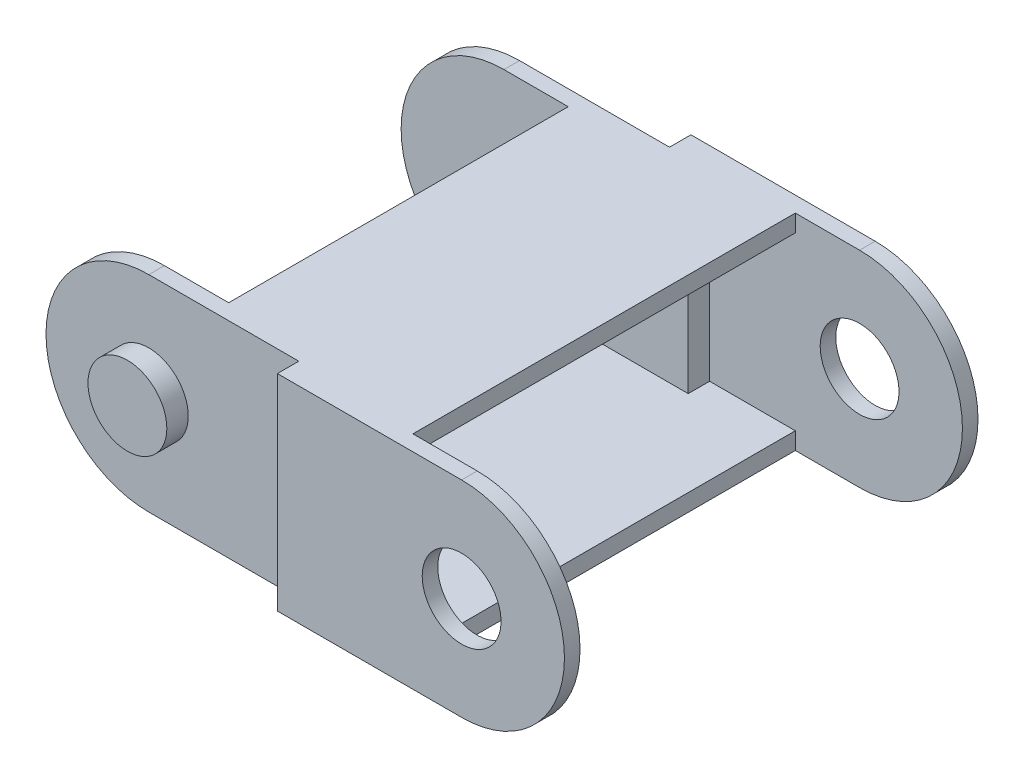
ISO-10303-21;
HEADER;
FILE_DESCRIPTION(('STEP AP214'),'2;1');
FILE_NAME('part.step','',(''),(''),'','','');
FILE_SCHEMA(('AUTOMOTIVE_DESIGN { 1 0 10303 214 1 1 1 1 }'));
ENDSEC;
DATA;
#1=APPLICATION_CONTEXT('core data for automotive mechanical design processes');
#2=APPLICATION_PROTOCOL_DEFINITION('international standard','automotive_design',2000,#1);
#3=PRODUCT_CONTEXT('',#1,'mechanical');
#4=PRODUCT('Part','Part','',(#3));
#5=PRODUCT_RELATED_PRODUCT_CATEGORY('part','',(#4));
#6=PRODUCT_DEFINITION_FORMATION('','',#4);
#7=PRODUCT_DEFINITION_CONTEXT('part definition',#1,'design');
#8=PRODUCT_DEFINITION('design','',#6,#7);
#9=PRODUCT_DEFINITION_SHAPE('','',#8);
#10=(LENGTH_UNIT() NAMED_UNIT(*) SI_UNIT(.MILLI.,.METRE.));
#11=(NAMED_UNIT(*) PLANE_ANGLE_UNIT() SI_UNIT($,.RADIAN.));
#12=(NAMED_UNIT(*) SI_UNIT($,.STERADIAN.) SOLID_ANGLE_UNIT());
#13=UNCERTAINTY_MEASURE_WITH_UNIT(LENGTH_MEASURE(1.E-05),#10,'distance_accuracy_value','');
#14=(GEOMETRIC_REPRESENTATION_CONTEXT(3) GLOBAL_UNCERTAINTY_ASSIGNED_CONTEXT((#13)) GLOBAL_UNIT_ASSIGNED_CONTEXT((#10,
#11,#12)) REPRESENTATION_CONTEXT('',''));
#15=CARTESIAN_POINT('',(0.,0.,0.));
#16=DIRECTION('',(0.,0.,1.));
#17=DIRECTION('',(1.,0.,0.));
#18=AXIS2_PLACEMENT_3D('',#15,#16,#17);
#19=CARTESIAN_POINT('',(-3.74999999999999,6.00000000000001,11.156));
#20=DIRECTION('',(-1.,0.,0.));
#21=DIRECTION('',(0.,0.,1.));
#22=AXIS2_PLACEMENT_3D('',#19,#20,#21);
#23=PLANE('',#22);
#24=DIRECTION('',(0.,0.,-1.));
#25=VECTOR('',#24,1.);
#26=CARTESIAN_POINT('',(-3.75,-5.,9.90600000000001));
#27=LINE('',#26,#25);
#28=CARTESIAN_POINT('',(-3.74999999999999,-5.00000000000003,11.156));
#29=VERTEX_POINT('',#28);
#30=CARTESIAN_POINT('',(-3.75,-5.,-11.156));
#31=VERTEX_POINT('',#30);
#32=EDGE_CURVE('E410',#29,#31,#27,.T.);
#33=ORIENTED_EDGE('',*,*,#32,.F.);
#34=DIRECTION('',(0.,-1.,0.));
#35=VECTOR('',#34,1.);
#36=CARTESIAN_POINT('',(-3.74999999999999,6.00000000000001,11.156));
#37=LINE('',#36,#35);
#38=CARTESIAN_POINT('',(-3.75,-6.00000000000001,11.156));
#39=VERTEX_POINT('',#38);
#40=EDGE_CURVE('E266',#29,#39,#37,.T.);
#41=ORIENTED_EDGE('',*,*,#40,.T.);
#42=DIRECTION('',(0.,0.,-1.));
#43=VECTOR('',#42,1.);
#44=CARTESIAN_POINT('',(-3.75,-6.00000000000001,11.156));
#45=LINE('',#44,#43);
#46=CARTESIAN_POINT('',(-3.75,-6.00000000000001,-11.156));
#47=VERTEX_POINT('',#46);
#48=EDGE_CURVE('E253',#39,#47,#45,.T.);
#49=ORIENTED_EDGE('',*,*,#48,.T.);
#50=DIRECTION('',(0.,-1.,0.));
#51=VECTOR('',#50,1.);
#52=CARTESIAN_POINT('',(-3.74999999999999,6.00000000000001,-11.156));
#53=LINE('',#52,#51);
#54=EDGE_CURVE('E252',#31,#47,#53,.T.);
#55=ORIENTED_EDGE('',*,*,#54,.F.);
#56=EDGE_LOOP('',(#33,#41,#49,#55));
#57=FACE_BOUND('',#56,.T.);
#58=ADVANCED_FACE('F37',(#57),#23,.F.);
#59=CARTESIAN_POINT('',(-25.5,6.00000000000001,-9.906));
#60=DIRECTION('',(0.,0.,-1.));
#61=DIRECTION('',(-1.,0.,0.));
#62=AXIS2_PLACEMENT_3D('',#59,#60,#61);
#63=PLANE('',#62);
#64=DIRECTION('',(0.,-1.,0.));
#65=VECTOR('',#64,1.);
#66=CARTESIAN_POINT('',(-8.75000000000001,5.,-9.90599999999998));
#67=LINE('',#66,#65);
#68=CARTESIAN_POINT('',(-8.75000000000001,5.,-9.90599999999998));
#69=VERTEX_POINT('',#68);
#70=CARTESIAN_POINT('',(-8.74999999999999,-5.00000000000002,-9.906));
#71=VERTEX_POINT('',#70);
#72=EDGE_CURVE('E52',#69,#71,#67,.T.);
#73=ORIENTED_EDGE('',*,*,#72,.F.);
#74=DIRECTION('',(1.,0.,0.));
#75=VECTOR('',#74,1.);
#76=CARTESIAN_POINT('',(-25.5,5.,-9.90599999999998));
#77=LINE('',#76,#75);
#78=CARTESIAN_POINT('',(-15.75,5.,-9.90599999999998));
#79=VERTEX_POINT('',#78);
#80=EDGE_CURVE('E226',#79,#69,#77,.T.);
#81=ORIENTED_EDGE('',*,*,#80,.F.);
#82=DIRECTION('',(0.,-1.,0.));
#83=VECTOR('',#82,1.);
#84=CARTESIAN_POINT('',(-15.75,6.00000000000001,-9.906));
#85=LINE('',#84,#83);
#86=CARTESIAN_POINT('',(-15.75,6.00000000000001,-9.906));
#87=VERTEX_POINT('',#86);
#88=EDGE_CURVE('E288',#87,#79,#85,.T.);
#89=ORIENTED_EDGE('',*,*,#88,.F.);
#90=DIRECTION('',(1.,0.,0.));
#91=VECTOR('',#90,1.);
#92=CARTESIAN_POINT('',(-25.5,6.00000000000001,-9.906));
#93=LINE('',#92,#91);
#94=CARTESIAN_POINT('',(-19.5,6.00000000000001,-9.906));
#95=VERTEX_POINT('',#94);
#96=EDGE_CURVE('E270',#95,#87,#93,.T.);
#97=ORIENTED_EDGE('',*,*,#96,.F.);
#98=CARTESIAN_POINT('',(-19.5,0.,-9.906));
#99=DIRECTION('',(0.,0.,-1.));
#100=DIRECTION('',(-1.,0.,0.));
#101=AXIS2_PLACEMENT_3D('',#98,#99,#100);
#102=CIRCLE('',#101,6.);
#103=CARTESIAN_POINT('',(-19.5,-5.99999999999999,-9.90599999999999));
#104=VERTEX_POINT('',#103);
#105=EDGE_CURVE('E328',#104,#95,#102,.T.);
#106=ORIENTED_EDGE('',*,*,#105,.F.);
#107=DIRECTION('',(-1.,0.,0.));
#108=VECTOR('',#107,1.);
#109=CARTESIAN_POINT('',(0.,-5.99999999999999,-9.906));
#110=LINE('',#109,#108);
#111=CARTESIAN_POINT('',(-15.75,-6.00000000000006,-9.906));
#112=VERTEX_POINT('',#111);
#113=EDGE_CURVE('E378',#112,#104,#110,.T.);
#114=ORIENTED_EDGE('',*,*,#113,.F.);
#115=CARTESIAN_POINT('',(-15.75,-5.,-9.906));
#116=VERTEX_POINT('',#115);
#117=EDGE_CURVE('E280',#116,#112,#85,.T.);
#118=ORIENTED_EDGE('',*,*,#117,.F.);
#119=DIRECTION('',(1.,0.,0.));
#120=VECTOR('',#119,1.);
#121=CARTESIAN_POINT('',(-25.5,-5.,-9.906));
#122=LINE('',#121,#120);
#123=EDGE_CURVE('E59',#116,#71,#122,.T.);
#124=ORIENTED_EDGE('',*,*,#123,.T.);
#125=EDGE_LOOP('',(#73,#81,#89,#97,#106,#114,#118,#124));
#126=FACE_BOUND('',#125,.T.);
#127=ADVANCED_FACE('F392',(#126),#63,.F.);
#128=CARTESIAN_POINT('',(-15.75,6.00000000000001,9.906));
#129=DIRECTION('',(1.,0.,0.));
#130=DIRECTION('',(0.,1.,0.));
#131=AXIS2_PLACEMENT_3D('',#128,#129,#130);
#132=PLANE('',#131);
#133=ORIENTED_EDGE('',*,*,#88,.T.);
#134=DIRECTION('',(0.,0.,1.));
#135=VECTOR('',#134,1.);
#136=CARTESIAN_POINT('',(-15.75,4.99999999999999,9.906));
#137=LINE('',#136,#135);
#138=CARTESIAN_POINT('',(-15.75,4.99999999999999,9.906));
#139=VERTEX_POINT('',#138);
#140=EDGE_CURVE('E11',#79,#139,#137,.T.);
#141=ORIENTED_EDGE('',*,*,#140,.T.);
#142=DIRECTION('',(0.,-1.,0.));
#143=VECTOR('',#142,1.);
#144=CARTESIAN_POINT('',(-15.75,6.00000000000001,9.906));
#145=LINE('',#144,#143);
#146=CARTESIAN_POINT('',(-15.75,6.00000000000001,9.906));
#147=VERTEX_POINT('',#146);
#148=EDGE_CURVE('E224',#147,#139,#145,.T.);
#149=ORIENTED_EDGE('',*,*,#148,.F.);
#150=DIRECTION('',(0.,0.,1.));
#151=VECTOR('',#150,1.);
#152=CARTESIAN_POINT('',(-15.75,6.00000000000001,9.906));
#153=LINE('',#152,#151);
#154=EDGE_CURVE('E273',#87,#147,#153,.T.);
#155=ORIENTED_EDGE('',*,*,#154,.F.);
#156=EDGE_LOOP('',(#133,#141,#149,#155));
#157=FACE_BOUND('',#156,.T.);
#158=ADVANCED_FACE('F478',(#157),#132,.F.);
#159=CARTESIAN_POINT('',(0.,0.,12.065));
#160=DIRECTION('',(0.,0.,-1.));
#161=DIRECTION('',(-1.,0.,0.));
#162=AXIS2_PLACEMENT_3D('',#159,#160,#161);
#163=CYLINDRICAL_SURFACE('',#162,6.);
#164=DIRECTION('',(0.,0.,-1.));
#165=VECTOR('',#164,1.);
#166=CARTESIAN_POINT('',(0.,-6.00000000000001,12.065));
#167=LINE('',#166,#165);
#168=CARTESIAN_POINT('',(0.,-6.00000000000001,12.065));
#169=VERTEX_POINT('',#168);
#170=CARTESIAN_POINT('',(0.,-6.00000000000001,11.156));
#171=VERTEX_POINT('',#170);
#172=EDGE_CURVE('E356',#169,#171,#167,.T.);
#173=ORIENTED_EDGE('',*,*,#172,.T.);
#174=CARTESIAN_POINT('',(0.,0.,11.156));
#175=DIRECTION('',(0.,0.,1.));
#176=DIRECTION('',(0.,-1.,0.));
#177=AXIS2_PLACEMENT_3D('',#174,#175,#176);
#178=CIRCLE('',#177,6.);
#179=CARTESIAN_POINT('',(0.,5.99999999999999,11.156));
#180=VERTEX_POINT('',#179);
#181=EDGE_CURVE('E322',#171,#180,#178,.T.);
#182=ORIENTED_EDGE('',*,*,#181,.T.);
#183=DIRECTION('',(0.,0.,-1.));
#184=VECTOR('',#183,1.);
#185=CARTESIAN_POINT('',(0.,5.99999999999999,12.065));
#186=LINE('',#185,#184);
#187=CARTESIAN_POINT('',(0.,5.99999999999999,12.065));
#188=VERTEX_POINT('',#187);
#189=EDGE_CURVE('E367',#188,#180,#186,.T.);
#190=ORIENTED_EDGE('',*,*,#189,.F.);
#191=CARTESIAN_POINT('',(0.,0.,12.065));
#192=DIRECTION('',(0.,0.,1.));
#193=DIRECTION('',(1.,0.,0.));
#194=AXIS2_PLACEMENT_3D('',#191,#192,#193);
#195=CIRCLE('',#194,6.);
#196=EDGE_CURVE('E339',#169,#188,#195,.T.);
#197=ORIENTED_EDGE('',*,*,#196,.F.);
#198=EDGE_LOOP('',(#173,#182,#190,#197));
#199=FACE_BOUND('',#198,.T.);
#200=ADVANCED_FACE('F441',(#199),#163,.T.);
#201=CARTESIAN_POINT('',(-19.5,0.,12.065));
#202=DIRECTION('',(0.,0.,-1.));
#203=DIRECTION('',(-1.,0.,0.));
#204=AXIS2_PLACEMENT_3D('',#201,#202,#203);
#205=CYLINDRICAL_SURFACE('',#204,6.);
#206=DIRECTION('',(0.,0.,-1.));
#207=VECTOR('',#206,1.);
#208=CARTESIAN_POINT('',(-19.5,5.99999999999998,12.065));
#209=LINE('',#208,#207);
#210=CARTESIAN_POINT('',(-19.5,6.00000000000001,10.815));
#211=VERTEX_POINT('',#210);
#212=CARTESIAN_POINT('',(-19.5,6.00000000000001,9.906));
#213=VERTEX_POINT('',#212);
#214=EDGE_CURVE('E366',#211,#213,#209,.T.);
#215=ORIENTED_EDGE('',*,*,#214,.T.);
#216=CARTESIAN_POINT('',(-19.5,0.,9.906));
#217=DIRECTION('',(0.,0.,1.));
#218=DIRECTION('',(1.,0.,0.));
#219=AXIS2_PLACEMENT_3D('',#216,#217,#218);
#220=CIRCLE('',#219,6.);
#221=CARTESIAN_POINT('',(-19.5,-5.99999999999999,9.906));
#222=VERTEX_POINT('',#221);
#223=EDGE_CURVE('E330',#213,#222,#220,.T.);
#224=ORIENTED_EDGE('',*,*,#223,.T.);
#225=DIRECTION('',(0.,0.,-1.));
#226=VECTOR('',#225,1.);
#227=CARTESIAN_POINT('',(-19.5,-5.99999999999999,12.065));
#228=LINE('',#227,#226);
#229=CARTESIAN_POINT('',(-19.5,-5.99999999999999,10.815));
#230=VERTEX_POINT('',#229);
#231=EDGE_CURVE('E362',#230,#222,#228,.T.);
#232=ORIENTED_EDGE('',*,*,#231,.F.);
#233=CARTESIAN_POINT('',(-19.5,0.,10.815));
#234=DIRECTION('',(0.,0.,-1.));
#235=DIRECTION('',(-1.,0.,0.));
#236=AXIS2_PLACEMENT_3D('',#233,#234,#235);
#237=CIRCLE('',#236,6.);
#238=EDGE_CURVE('E324',#230,#211,#237,.T.);
#239=ORIENTED_EDGE('',*,*,#238,.T.);
#240=EDGE_LOOP('',(#215,#224,#232,#239));
#241=FACE_BOUND('',#240,.T.);
#242=ADVANCED_FACE('F455',(#241),#205,.T.);
#243=CARTESIAN_POINT('',(0.,0.,12.065));
#244=DIRECTION('',(0.,0.,-1.));
#245=DIRECTION('',(-1.,0.,0.));
#246=AXIS2_PLACEMENT_3D('',#243,#244,#245);
#247=CYLINDRICAL_SURFACE('',#246,2.2999954);
#248=CARTESIAN_POINT('',(0.,0.,11.156));
#249=DIRECTION('',(0.,0.,1.));
#250=DIRECTION('',(0.,-1.,0.));
#251=AXIS2_PLACEMENT_3D('',#248,#249,#250);
#252=CIRCLE('',#251,2.2999954);
#253=CARTESIAN_POINT('',(-2.2999954,0.,11.156));
#254=VERTEX_POINT('',#253);
#255=EDGE_CURVE('E321',#254,#254,#252,.T.);
#256=CARTESIAN_POINT('',(0.,0.,12.065));
#257=DIRECTION('',(0.,0.,1.));
#258=DIRECTION('',(1.,0.,0.));
#259=AXIS2_PLACEMENT_3D('',#256,#257,#258);
#260=CIRCLE('',#259,2.2999954);
#261=CARTESIAN_POINT('',(-2.2999954,0.,12.065));
#262=VERTEX_POINT('',#261);
#263=EDGE_CURVE('E333',#262,#262,#260,.T.);
#264=CARTESIAN_POINT('',(-2.2999954,0.,11.156));
#265=CARTESIAN_POINT('',(-2.2999954,0.,11.16546875));
#266=CARTESIAN_POINT('',(-2.2999954,0.,11.1749375));
#267=CARTESIAN_POINT('',(-2.2999954,0.,11.193875));
#268=CARTESIAN_POINT('',(-2.2999954,0.,11.20334375));
#269=CARTESIAN_POINT('',(-2.2999954,0.,11.22228125));
#270=CARTESIAN_POINT('',(-2.2999954,0.,11.23175));
#271=CARTESIAN_POINT('',(-2.2999954,0.,11.2506875));
#272=CARTESIAN_POINT('',(-2.2999954,0.,11.26015625));
#273=CARTESIAN_POINT('',(-2.2999954,0.,11.27909375));
#274=CARTESIAN_POINT('',(-2.2999954,0.,11.2885625));
#275=CARTESIAN_POINT('',(-2.2999954,0.,11.3075));
#276=CARTESIAN_POINT('',(-2.2999954,0.,11.31696875));
#277=CARTESIAN_POINT('',(-2.2999954,0.,11.33590625));
#278=CARTESIAN_POINT('',(-2.2999954,0.,11.345375));
#279=CARTESIAN_POINT('',(-2.2999954,0.,11.3643125));
#280=CARTESIAN_POINT('',(-2.2999954,0.,11.37378125));
#281=CARTESIAN_POINT('',(-2.2999954,0.,11.39271875));
#282=CARTESIAN_POINT('',(-2.2999954,0.,11.4021875));
#283=CARTESIAN_POINT('',(-2.2999954,0.,11.421125));
#284=CARTESIAN_POINT('',(-2.2999954,0.,11.43059375));
#285=CARTESIAN_POINT('',(-2.2999954,0.,11.44953125));
#286=CARTESIAN_POINT('',(-2.2999954,0.,11.459));
#287=CARTESIAN_POINT('',(-2.2999954,0.,11.4779375));
#288=CARTESIAN_POINT('',(-2.2999954,0.,11.48740625));
#289=CARTESIAN_POINT('',(-2.2999954,0.,11.50634375));
#290=CARTESIAN_POINT('',(-2.2999954,0.,11.5158125));
#291=CARTESIAN_POINT('',(-2.2999954,0.,11.53475));
#292=CARTESIAN_POINT('',(-2.2999954,0.,11.54421875));
#293=CARTESIAN_POINT('',(-2.2999954,0.,11.56315625));
#294=CARTESIAN_POINT('',(-2.2999954,0.,11.572625));
#295=CARTESIAN_POINT('',(-2.2999954,0.,11.5915625));
#296=CARTESIAN_POINT('',(-2.2999954,0.,11.60103125));
#297=CARTESIAN_POINT('',(-2.2999954,0.,11.61996875));
#298=CARTESIAN_POINT('',(-2.2999954,0.,11.6294375));
#299=CARTESIAN_POINT('',(-2.2999954,0.,11.648375));
#300=CARTESIAN_POINT('',(-2.2999954,0.,11.65784375));
#301=CARTESIAN_POINT('',(-2.2999954,0.,11.67678125));
#302=CARTESIAN_POINT('',(-2.2999954,0.,11.68625));
#303=CARTESIAN_POINT('',(-2.2999954,0.,11.7051875));
#304=CARTESIAN_POINT('',(-2.2999954,0.,11.71465625));
#305=CARTESIAN_POINT('',(-2.2999954,0.,11.73359375));
#306=CARTESIAN_POINT('',(-2.2999954,0.,11.7430625));
#307=CARTESIAN_POINT('',(-2.2999954,0.,11.762));
#308=CARTESIAN_POINT('',(-2.2999954,0.,11.77146875));
#309=CARTESIAN_POINT('',(-2.2999954,0.,11.79040625));
#310=CARTESIAN_POINT('',(-2.2999954,0.,11.799875));
#311=CARTESIAN_POINT('',(-2.2999954,0.,11.8188125));
#312=CARTESIAN_POINT('',(-2.2999954,0.,11.82828125));
#313=CARTESIAN_POINT('',(-2.2999954,0.,11.84721875));
#314=CARTESIAN_POINT('',(-2.2999954,0.,11.8566875));
#315=CARTESIAN_POINT('',(-2.2999954,0.,11.875625));
#316=CARTESIAN_POINT('',(-2.2999954,0.,11.88509375));
#317=CARTESIAN_POINT('',(-2.2999954,0.,11.90403125));
#318=CARTESIAN_POINT('',(-2.2999954,0.,11.9135));
#319=CARTESIAN_POINT('',(-2.2999954,0.,11.9324375));
#320=CARTESIAN_POINT('',(-2.2999954,0.,11.94190625));
#321=CARTESIAN_POINT('',(-2.2999954,0.,11.96084375));
#322=CARTESIAN_POINT('',(-2.2999954,0.,11.9703125));
#323=CARTESIAN_POINT('',(-2.2999954,0.,11.98925));
#324=CARTESIAN_POINT('',(-2.2999954,0.,11.99871875));
#325=CARTESIAN_POINT('',(-2.2999954,0.,12.01765625));
#326=CARTESIAN_POINT('',(-2.2999954,0.,12.027125));
#327=CARTESIAN_POINT('',(-2.2999954,0.,12.0460625));
#328=CARTESIAN_POINT('',(-2.2999954,0.,12.05553125));
#329=CARTESIAN_POINT('',(-2.2999954,0.,12.065));
#330=B_SPLINE_CURVE_WITH_KNOTS('',3,(#264,#265,#266,#267,#268,#269,#270,#271,#272,#273,#274,
#275,#276,#277,#278,#279,#280,#281,#282,#283,#284,#285,#286,#287,#288,#289,#290,#291,#292,#293,
#294,#295,#296,#297,#298,#299,#300,#301,#302,#303,#304,#305,#306,#307,#308,#309,#310,#311,#312,
#313,#314,#315,#316,#317,#318,#319,#320,#321,#322,#323,#324,#325,#326,#327,#328,#329),
.UNSPECIFIED.,.F.,.F.,(4,2,2,2,2,2,2,2,2,2,2,2,2,2,2,2,2,2,2,2,2,2,2,2,2,2,2,2,2,2,2,2,4),(0.,
0.0284062500000015,0.0568125000000013,0.0852187500000011,0.113625000000001,0.142031250000001,
0.1704375,0.19884375,0.22725,0.255656250000002,0.284062500000001,0.312468750000001,
0.340875000000001,0.369281250000001,0.3976875,0.42609375,0.4545,0.482906250000002,
0.511312500000001,0.539718750000001,0.568125000000001,0.596531250000001,0.6249375,0.65334375,
0.681750000000002,0.710156250000002,0.738562500000001,0.766968750000001,0.795375000000001,
0.823781250000001,0.852187500000001,0.88059375,0.909000000000002),.UNSPECIFIED.);
#331=EDGE_CURVE('BSEAM625',#254,#262,#330,.T.);
#332=ORIENTED_EDGE('',*,*,#255,.F.);
#333=ORIENTED_EDGE('',*,*,#263,.T.);
#334=ORIENTED_EDGE('',*,*,#331,.T.);
#335=ORIENTED_EDGE('',*,*,#331,.F.);
#336=EDGE_LOOP('',(#332,#334,#333,#335));
#337=FACE_BOUND('',#336,.T.);
#338=ADVANCED_FACE('F625',(#337),#247,.F.);
#339=CARTESIAN_POINT('',(0.,0.,12.065));
#340=DIRECTION('',(0.,0.,1.));
#341=DIRECTION('',(1.,0.,0.));
#342=AXIS2_PLACEMENT_3D('',#339,#340,#341);
#343=PLANE('',#342);
#344=DIRECTION('',(0.,-1.,0.));
#345=VECTOR('',#344,1.);
#346=CARTESIAN_POINT('',(-10.75,6.00000000000001,12.065));
#347=LINE('',#346,#345);
#348=CARTESIAN_POINT('',(-10.75,6.00000000000001,12.065));
#349=VERTEX_POINT('',#348);
#350=CARTESIAN_POINT('',(-10.75,-6.00000000000001,12.065));
#351=VERTEX_POINT('',#350);
#352=EDGE_CURVE('E298',#349,#351,#347,.T.);
#353=ORIENTED_EDGE('',*,*,#352,.T.);
#354=DIRECTION('',(1.,0.,0.));
#355=VECTOR('',#354,1.);
#356=CARTESIAN_POINT('',(0.,-6.00000000000001,12.065));
#357=LINE('',#356,#355);
#358=EDGE_CURVE('E346',#351,#169,#357,.T.);
#359=ORIENTED_EDGE('',*,*,#358,.T.);
#360=ORIENTED_EDGE('',*,*,#196,.T.);
#361=DIRECTION('',(-1.,0.,0.));
#362=VECTOR('',#361,1.);
#363=CARTESIAN_POINT('',(0.,5.99999999999999,12.065));
#364=LINE('',#363,#362);
#365=EDGE_CURVE('E342',#188,#349,#364,.T.);
#366=ORIENTED_EDGE('',*,*,#365,.T.);
#367=EDGE_LOOP('',(#353,#359,#360,#366));
#368=FACE_BOUND('',#367,.T.);
#369=ORIENTED_EDGE('',*,*,#263,.F.);
#370=EDGE_LOOP('',(#369));
#371=FACE_BOUND('',#370,.T.);
#372=ADVANCED_FACE('F443',(#368,#371),#343,.T.);
#373=CARTESIAN_POINT('',(0.,0.,-12.065));
#374=DIRECTION('',(0.,0.,1.));
#375=DIRECTION('',(1.,0.,0.));
#376=AXIS2_PLACEMENT_3D('',#373,#374,#375);
#377=PLANE('',#376);
#378=DIRECTION('',(1.,0.,0.));
#379=VECTOR('',#378,1.);
#380=CARTESIAN_POINT('',(0.,-6.00000000000001,-12.065));
#381=LINE('',#380,#379);
#382=CARTESIAN_POINT('',(-10.75,-6.00000000000001,-12.065));
#383=VERTEX_POINT('',#382);
#384=CARTESIAN_POINT('',(0.,-6.00000000000001,-12.065));
#385=VERTEX_POINT('',#384);
#386=EDGE_CURVE('E343',#383,#385,#381,.T.);
#387=ORIENTED_EDGE('',*,*,#386,.F.);
#388=DIRECTION('',(0.,-1.,0.));
#389=VECTOR('',#388,1.);
#390=CARTESIAN_POINT('',(-10.75,6.00000000000001,-12.065));
#391=LINE('',#390,#389);
#392=CARTESIAN_POINT('',(-10.75,6.00000000000001,-12.065));
#393=VERTEX_POINT('',#392);
#394=EDGE_CURVE('E312',#393,#383,#391,.T.);
#395=ORIENTED_EDGE('',*,*,#394,.F.);
#396=DIRECTION('',(-1.,0.,0.));
#397=VECTOR('',#396,1.);
#398=CARTESIAN_POINT('',(0.,5.99999999999999,-12.065));
#399=LINE('',#398,#397);
#400=CARTESIAN_POINT('',(0.,5.99999999999999,-12.065));
#401=VERTEX_POINT('',#400);
#402=EDGE_CURVE('E351',#401,#393,#399,.T.);
#403=ORIENTED_EDGE('',*,*,#402,.F.);
#404=CARTESIAN_POINT('',(0.,0.,-12.065));
#405=DIRECTION('',(0.,0.,1.));
#406=DIRECTION('',(1.,0.,0.));
#407=AXIS2_PLACEMENT_3D('',#404,#405,#406);
#408=CIRCLE('',#407,6.);
#409=EDGE_CURVE('E336',#385,#401,#408,.T.);
#410=ORIENTED_EDGE('',*,*,#409,.F.);
#411=EDGE_LOOP('',(#387,#395,#403,#410));
#412=FACE_BOUND('',#411,.T.);
#413=CARTESIAN_POINT('',(0.,0.,-12.065));
#414=DIRECTION('',(0.,0.,1.));
#415=DIRECTION('',(1.,0.,0.));
#416=AXIS2_PLACEMENT_3D('',#413,#414,#415);
#417=CIRCLE('',#416,2.2999954);
#418=CARTESIAN_POINT('',(-2.2999954,0.,-12.065));
#419=VERTEX_POINT('',#418);
#420=EDGE_CURVE('E332',#419,#419,#417,.T.);
#421=ORIENTED_EDGE('',*,*,#420,.T.);
#422=EDGE_LOOP('',(#421));
#423=FACE_BOUND('',#422,.T.);
#424=ADVANCED_FACE('F463',(#412,#423),#377,.F.);
#425=CARTESIAN_POINT('',(0.,5.99999999999999,-11.156));
#426=VERTEX_POINT('',#425);
#427=EDGE_CURVE('E371',#426,#401,#186,.T.);
#428=ORIENTED_EDGE('',*,*,#427,.F.);
#429=CARTESIAN_POINT('',(0.,0.,-11.156));
#430=DIRECTION('',(0.,0.,-1.));
#431=DIRECTION('',(0.,1.,0.));
#432=AXIS2_PLACEMENT_3D('',#429,#430,#431);
#433=CIRCLE('',#432,6.);
#434=CARTESIAN_POINT('',(0.,-6.00000000000001,-11.156));
#435=VERTEX_POINT('',#434);
#436=EDGE_CURVE('E319',#426,#435,#433,.T.);
#437=ORIENTED_EDGE('',*,*,#436,.T.);
#438=EDGE_CURVE('E348',#435,#385,#167,.T.);
#439=ORIENTED_EDGE('',*,*,#438,.T.);
#440=ORIENTED_EDGE('',*,*,#409,.T.);
#441=EDGE_LOOP('',(#428,#437,#439,#440));
#442=FACE_BOUND('',#441,.T.);
#443=ADVANCED_FACE('F39',(#442),#163,.T.);
#444=CARTESIAN_POINT('',(0.,5.99999999999999,12.065));
#445=DIRECTION('',(0.,-1.,0.));
#446=DIRECTION('',(1.,0.,0.));
#447=AXIS2_PLACEMENT_3D('',#444,#445,#446);
#448=PLANE('',#447);
#449=ORIENTED_EDGE('',*,*,#189,.T.);
#450=DIRECTION('',(-1.,0.,0.));
#451=VECTOR('',#450,1.);
#452=CARTESIAN_POINT('',(-3.74999999999999,6.00000000000001,11.156));
#453=LINE('',#452,#451);
#454=CARTESIAN_POINT('',(-3.74999999999999,6.00000000000001,11.156));
#455=VERTEX_POINT('',#454);
#456=EDGE_CURVE('E249',#180,#455,#453,.T.);
#457=ORIENTED_EDGE('',*,*,#456,.T.);
#458=DIRECTION('',(0.,0.,-1.));
#459=VECTOR('',#458,1.);
#460=CARTESIAN_POINT('',(-3.74999999999999,6.00000000000001,11.156));
#461=LINE('',#460,#459);
#462=CARTESIAN_POINT('',(-3.74999999999999,6.00000000000001,-11.156));
#463=VERTEX_POINT('',#462);
#464=EDGE_CURVE('E242',#455,#463,#461,.T.);
#465=ORIENTED_EDGE('',*,*,#464,.T.);
#466=DIRECTION('',(1.,0.,0.));
#467=VECTOR('',#466,1.);
#468=CARTESIAN_POINT('',(-3.74999999999999,6.00000000000001,-11.156));
#469=LINE('',#468,#467);
#470=EDGE_CURVE('E245',#463,#426,#469,.T.);
#471=ORIENTED_EDGE('',*,*,#470,.T.);
#472=ORIENTED_EDGE('',*,*,#427,.T.);
#473=ORIENTED_EDGE('',*,*,#402,.T.);
#474=DIRECTION('',(0.,0.,1.));
#475=VECTOR('',#474,1.);
#476=CARTESIAN_POINT('',(-10.75,6.00000000000001,-10.815));
#477=LINE('',#476,#475);
#478=CARTESIAN_POINT('',(-10.75,6.00000000000001,-10.815));
#479=VERTEX_POINT('',#478);
#480=EDGE_CURVE('E305',#393,#479,#477,.T.);
#481=ORIENTED_EDGE('',*,*,#480,.T.);
#482=DIRECTION('',(-1.,0.,0.));
#483=VECTOR('',#482,1.);
#484=CARTESIAN_POINT('',(-25.5,6.00000000000001,-10.815));
#485=LINE('',#484,#483);
#486=CARTESIAN_POINT('',(-19.5,6.00000000000001,-10.815));
#487=VERTEX_POINT('',#486);
#488=EDGE_CURVE('E308',#479,#487,#485,.T.);
#489=ORIENTED_EDGE('',*,*,#488,.T.);
#490=EDGE_CURVE('E363',#95,#487,#209,.T.);
#491=ORIENTED_EDGE('',*,*,#490,.F.);
#492=ORIENTED_EDGE('',*,*,#96,.T.);
#493=ORIENTED_EDGE('',*,*,#154,.T.);
#494=DIRECTION('',(-1.,0.,0.));
#495=VECTOR('',#494,1.);
#496=CARTESIAN_POINT('',(-25.5,6.00000000000001,9.906));
#497=LINE('',#496,#495);
#498=EDGE_CURVE('E277',#147,#213,#497,.T.);
#499=ORIENTED_EDGE('',*,*,#498,.T.);
#500=ORIENTED_EDGE('',*,*,#214,.F.);
#501=DIRECTION('',(1.,0.,0.));
#502=VECTOR('',#501,1.);
#503=CARTESIAN_POINT('',(-10.75,6.00000000000001,10.815));
#504=LINE('',#503,#502);
#505=CARTESIAN_POINT('',(-10.75,6.00000000000001,10.815));
#506=VERTEX_POINT('',#505);
#507=EDGE_CURVE('E294',#211,#506,#504,.T.);
#508=ORIENTED_EDGE('',*,*,#507,.T.);
#509=DIRECTION('',(0.,0.,1.));
#510=VECTOR('',#509,1.);
#511=CARTESIAN_POINT('',(-10.75,6.00000000000001,12.065));
#512=LINE('',#511,#510);
#513=EDGE_CURVE('E291',#506,#349,#512,.T.);
#514=ORIENTED_EDGE('',*,*,#513,.T.);
#515=ORIENTED_EDGE('',*,*,#365,.F.);
#516=EDGE_LOOP('',(#449,#457,#465,#471,#472,#473,#481,#489,#491,#492,#493,#499,#500,#508,#514,#515));
#517=FACE_BOUND('',#516,.T.);
#518=ADVANCED_FACE('F433',(#517),#448,.F.);
#519=ORIENTED_EDGE('',*,*,#105,.T.);
#520=ORIENTED_EDGE('',*,*,#490,.T.);
#521=CARTESIAN_POINT('',(-19.5,0.,-10.815));
#522=DIRECTION('',(0.,0.,1.));
#523=DIRECTION('',(1.,0.,0.));
#524=AXIS2_PLACEMENT_3D('',#521,#522,#523);
#525=CIRCLE('',#524,6.);
#526=CARTESIAN_POINT('',(-19.5,-5.99999999999999,-10.815));
#527=VERTEX_POINT('',#526);
#528=EDGE_CURVE('E326',#487,#527,#525,.T.);
#529=ORIENTED_EDGE('',*,*,#528,.T.);
#530=EDGE_CURVE('E359',#104,#527,#228,.T.);
#531=ORIENTED_EDGE('',*,*,#530,.F.);
#532=EDGE_LOOP('',(#519,#520,#529,#531));
#533=FACE_BOUND('',#532,.T.);
#534=ADVANCED_FACE('F474',(#533),#205,.T.);
#535=CARTESIAN_POINT('',(0.,-6.00000000000001,12.065));
#536=DIRECTION('',(0.,1.,0.));
#537=DIRECTION('',(-1.,0.,0.));
#538=AXIS2_PLACEMENT_3D('',#535,#536,#537);
#539=PLANE('',#538);
#540=ORIENTED_EDGE('',*,*,#48,.F.);
#541=DIRECTION('',(-1.,0.,0.));
#542=VECTOR('',#541,1.);
#543=CARTESIAN_POINT('',(-3.75,-6.00000000000001,11.156));
#544=LINE('',#543,#542);
#545=EDGE_CURVE('E246',#171,#39,#544,.T.);
#546=ORIENTED_EDGE('',*,*,#545,.F.);
#547=ORIENTED_EDGE('',*,*,#172,.F.);
#548=ORIENTED_EDGE('',*,*,#358,.F.);
#549=DIRECTION('',(0.,0.,1.));
#550=VECTOR('',#549,1.);
#551=CARTESIAN_POINT('',(-10.75,-6.00000000000001,12.065));
#552=LINE('',#551,#550);
#553=CARTESIAN_POINT('',(-10.75,-6.00000000000001,10.815));
#554=VERTEX_POINT('',#553);
#555=EDGE_CURVE('E295',#554,#351,#552,.T.);
#556=ORIENTED_EDGE('',*,*,#555,.F.);
#557=DIRECTION('',(-1.,0.,0.));
#558=VECTOR('',#557,1.);
#559=CARTESIAN_POINT('',(0.,-6.00000000000001,10.815));
#560=LINE('',#559,#558);
#561=EDGE_CURVE('E370',#554,#230,#560,.T.);
#562=ORIENTED_EDGE('',*,*,#561,.T.);
#563=ORIENTED_EDGE('',*,*,#231,.T.);
#564=DIRECTION('',(-1.,0.,0.));
#565=VECTOR('',#564,1.);
#566=CARTESIAN_POINT('',(-25.5,-6.00000000000001,9.906));
#567=LINE('',#566,#565);
#568=CARTESIAN_POINT('',(-15.75,-6.00000000000006,9.906));
#569=VERTEX_POINT('',#568);
#570=EDGE_CURVE('E274',#569,#222,#567,.T.);
#571=ORIENTED_EDGE('',*,*,#570,.F.);
#572=DIRECTION('',(0.,0.,1.));
#573=VECTOR('',#572,1.);
#574=CARTESIAN_POINT('',(-15.75,-6.00000000000006,9.906));
#575=LINE('',#574,#573);
#576=EDGE_CURVE('E241',#112,#569,#575,.T.);
#577=ORIENTED_EDGE('',*,*,#576,.F.);
#578=ORIENTED_EDGE('',*,*,#113,.T.);
#579=ORIENTED_EDGE('',*,*,#530,.T.);
#580=DIRECTION('',(-1.,0.,0.));
#581=VECTOR('',#580,1.);
#582=CARTESIAN_POINT('',(-25.5,-6.00000000000001,-10.815));
#583=LINE('',#582,#581);
#584=CARTESIAN_POINT('',(-10.75,-6.00000000000001,-10.815));
#585=VERTEX_POINT('',#584);
#586=EDGE_CURVE('E309',#585,#527,#583,.T.);
#587=ORIENTED_EDGE('',*,*,#586,.F.);
#588=DIRECTION('',(0.,0.,1.));
#589=VECTOR('',#588,1.);
#590=CARTESIAN_POINT('',(-10.75,-6.00000000000001,-10.815));
#591=LINE('',#590,#589);
#592=EDGE_CURVE('E286',#383,#585,#591,.T.);
#593=ORIENTED_EDGE('',*,*,#592,.F.);
#594=ORIENTED_EDGE('',*,*,#386,.T.);
#595=ORIENTED_EDGE('',*,*,#438,.F.);
#596=DIRECTION('',(1.,0.,0.));
#597=VECTOR('',#596,1.);
#598=CARTESIAN_POINT('',(-3.75,-6.00000000000001,-11.156));
#599=LINE('',#598,#597);
#600=EDGE_CURVE('E256',#47,#435,#599,.T.);
#601=ORIENTED_EDGE('',*,*,#600,.F.);
#602=EDGE_LOOP('',(#540,#546,#547,#548,#556,#562,#563,#571,#577,#578,#579,#587,#593,#594,#595,#601));
#603=FACE_BOUND('',#602,.T.);
#604=ADVANCED_FACE('F399',(#603),#539,.F.);
#605=CARTESIAN_POINT('',(0.,0.,-11.156));
#606=DIRECTION('',(0.,0.,-1.));
#607=DIRECTION('',(0.,1.,0.));
#608=AXIS2_PLACEMENT_3D('',#605,#606,#607);
#609=CIRCLE('',#608,2.2999954);
#610=CARTESIAN_POINT('',(-2.2999954,0.,-11.156));
#611=VERTEX_POINT('',#610);
#612=EDGE_CURVE('E265',#611,#611,#609,.T.);
#613=CARTESIAN_POINT('',(-2.2999954,0.,-11.156));
#614=CARTESIAN_POINT('',(-2.2999954,0.,-11.16546875));
#615=CARTESIAN_POINT('',(-2.2999954,0.,-11.1749375));
#616=CARTESIAN_POINT('',(-2.2999954,0.,-11.193875));
#617=CARTESIAN_POINT('',(-2.2999954,0.,-11.20334375));
#618=CARTESIAN_POINT('',(-2.2999954,0.,-11.22228125));
#619=CARTESIAN_POINT('',(-2.2999954,0.,-11.23175));
#620=CARTESIAN_POINT('',(-2.2999954,0.,-11.2506875));
#621=CARTESIAN_POINT('',(-2.2999954,0.,-11.26015625));
#622=CARTESIAN_POINT('',(-2.2999954,0.,-11.27909375));
#623=CARTESIAN_POINT('',(-2.2999954,0.,-11.2885625));
#624=CARTESIAN_POINT('',(-2.2999954,0.,-11.3075));
#625=CARTESIAN_POINT('',(-2.2999954,0.,-11.31696875));
#626=CARTESIAN_POINT('',(-2.2999954,0.,-11.33590625));
#627=CARTESIAN_POINT('',(-2.2999954,0.,-11.345375));
#628=CARTESIAN_POINT('',(-2.2999954,0.,-11.3643125));
#629=CARTESIAN_POINT('',(-2.2999954,0.,-11.37378125));
#630=CARTESIAN_POINT('',(-2.2999954,0.,-11.39271875));
#631=CARTESIAN_POINT('',(-2.2999954,0.,-11.4021875));
#632=CARTESIAN_POINT('',(-2.2999954,0.,-11.421125));
#633=CARTESIAN_POINT('',(-2.2999954,0.,-11.43059375));
#634=CARTESIAN_POINT('',(-2.2999954,0.,-11.44953125));
#635=CARTESIAN_POINT('',(-2.2999954,0.,-11.459));
#636=CARTESIAN_POINT('',(-2.2999954,0.,-11.4779375));
#637=CARTESIAN_POINT('',(-2.2999954,0.,-11.48740625));
#638=CARTESIAN_POINT('',(-2.2999954,0.,-11.50634375));
#639=CARTESIAN_POINT('',(-2.2999954,0.,-11.5158125));
#640=CARTESIAN_POINT('',(-2.2999954,0.,-11.53475));
#641=CARTESIAN_POINT('',(-2.2999954,0.,-11.54421875));
#642=CARTESIAN_POINT('',(-2.2999954,0.,-11.56315625));
#643=CARTESIAN_POINT('',(-2.2999954,0.,-11.572625));
#644=CARTESIAN_POINT('',(-2.2999954,0.,-11.5915625));
#645=CARTESIAN_POINT('',(-2.2999954,0.,-11.60103125));
#646=CARTESIAN_POINT('',(-2.2999954,0.,-11.61996875));
#647=CARTESIAN_POINT('',(-2.2999954,0.,-11.6294375));
#648=CARTESIAN_POINT('',(-2.2999954,0.,-11.648375));
#649=CARTESIAN_POINT('',(-2.2999954,0.,-11.65784375));
#650=CARTESIAN_POINT('',(-2.2999954,0.,-11.67678125));
#651=CARTESIAN_POINT('',(-2.2999954,0.,-11.68625));
#652=CARTESIAN_POINT('',(-2.2999954,0.,-11.7051875));
#653=CARTESIAN_POINT('',(-2.2999954,0.,-11.71465625));
#654=CARTESIAN_POINT('',(-2.2999954,0.,-11.73359375));
#655=CARTESIAN_POINT('',(-2.2999954,0.,-11.7430625));
#656=CARTESIAN_POINT('',(-2.2999954,0.,-11.762));
#657=CARTESIAN_POINT('',(-2.2999954,0.,-11.77146875));
#658=CARTESIAN_POINT('',(-2.2999954,0.,-11.79040625));
#659=CARTESIAN_POINT('',(-2.2999954,0.,-11.799875));
#660=CARTESIAN_POINT('',(-2.2999954,0.,-11.8188125));
#661=CARTESIAN_POINT('',(-2.2999954,0.,-11.82828125));
#662=CARTESIAN_POINT('',(-2.2999954,0.,-11.84721875));
#663=CARTESIAN_POINT('',(-2.2999954,0.,-11.8566875));
#664=CARTESIAN_POINT('',(-2.2999954,0.,-11.875625));
#665=CARTESIAN_POINT('',(-2.2999954,0.,-11.88509375));
#666=CARTESIAN_POINT('',(-2.2999954,0.,-11.90403125));
#667=CARTESIAN_POINT('',(-2.2999954,0.,-11.9135));
#668=CARTESIAN_POINT('',(-2.2999954,0.,-11.9324375));
#669=CARTESIAN_POINT('',(-2.2999954,0.,-11.94190625));
#670=CARTESIAN_POINT('',(-2.2999954,0.,-11.96084375));
#671=CARTESIAN_POINT('',(-2.2999954,0.,-11.9703125));
#672=CARTESIAN_POINT('',(-2.2999954,0.,-11.98925));
#673=CARTESIAN_POINT('',(-2.2999954,0.,-11.99871875));
#674=CARTESIAN_POINT('',(-2.2999954,0.,-12.01765625));
#675=CARTESIAN_POINT('',(-2.2999954,0.,-12.027125));
#676=CARTESIAN_POINT('',(-2.2999954,0.,-12.0460625));
#677=CARTESIAN_POINT('',(-2.2999954,0.,-12.05553125));
#678=CARTESIAN_POINT('',(-2.2999954,0.,-12.065));
#679=B_SPLINE_CURVE_WITH_KNOTS('',3,(#613,#614,#615,#616,#617,#618,#619,#620,#621,#622,#623,
#624,#625,#626,#627,#628,#629,#630,#631,#632,#633,#634,#635,#636,#637,#638,#639,#640,#641,#642,
#643,#644,#645,#646,#647,#648,#649,#650,#651,#652,#653,#654,#655,#656,#657,#658,#659,#660,#661,
#662,#663,#664,#665,#666,#667,#668,#669,#670,#671,#672,#673,#674,#675,#676,#677,#678),
.UNSPECIFIED.,.F.,.F.,(4,2,2,2,2,2,2,2,2,2,2,2,2,2,2,2,2,2,2,2,2,2,2,2,2,2,2,2,2,2,2,2,4),(0.,
0.0284062500000015,0.0568124999999996,0.0852187500000011,0.113624999999999,0.142031250000001,
0.170437499999999,0.19884375,0.227249999999998,0.25565625,0.284062500000001,0.312468749999999,
0.340875000000001,0.369281249999999,0.3976875,0.426093749999998,0.4545,0.482906250000002,
0.5113125,0.539718750000001,0.568124999999999,0.596531250000001,0.624937499999999,0.65334375,
0.681750000000002,0.71015625,0.738562500000001,0.766968749999999,0.795375000000001,
0.823781249999999,0.852187500000001,0.880593749999999,0.909),.UNSPECIFIED.);
#680=EDGE_CURVE('BSEAM504',#611,#419,#679,.T.);
#681=ORIENTED_EDGE('',*,*,#612,.F.);
#682=ORIENTED_EDGE('',*,*,#420,.F.);
#683=ORIENTED_EDGE('',*,*,#680,.T.);
#684=ORIENTED_EDGE('',*,*,#680,.F.);
#685=EDGE_LOOP('',(#681,#683,#682,#684));
#686=FACE_BOUND('',#685,.T.);
#687=ADVANCED_FACE('F504',(#686),#247,.F.);
#688=CARTESIAN_POINT('',(-3.74999999999999,6.00000000000001,11.156));
#689=DIRECTION('',(0.,0.,1.));
#690=DIRECTION('',(0.,-1.,0.));
#691=AXIS2_PLACEMENT_3D('',#688,#689,#690);
#692=PLANE('',#691);
#693=ORIENTED_EDGE('',*,*,#255,.T.);
#694=EDGE_LOOP('',(#693));
#695=FACE_BOUND('',#694,.T.);
#696=ORIENTED_EDGE('',*,*,#545,.T.);
#697=ORIENTED_EDGE('',*,*,#40,.F.);
#698=DIRECTION('',(1.,0.,0.));
#699=VECTOR('',#698,1.);
#700=CARTESIAN_POINT('',(-8.74999999999999,-5.00000000000002,11.156));
#701=LINE('',#700,#699);
#702=CARTESIAN_POINT('',(-8.74999999999999,-5.00000000000002,11.156));
#703=VERTEX_POINT('',#702);
#704=EDGE_CURVE('E404',#703,#29,#701,.T.);
#705=ORIENTED_EDGE('',*,*,#704,.F.);
#706=DIRECTION('',(0.,-1.,0.));
#707=VECTOR('',#706,1.);
#708=CARTESIAN_POINT('',(-8.74999999999999,5.,11.156));
#709=LINE('',#708,#707);
#710=CARTESIAN_POINT('',(-8.74999999999999,5.,11.156));
#711=VERTEX_POINT('',#710);
#712=EDGE_CURVE('E209',#711,#703,#709,.T.);
#713=ORIENTED_EDGE('',*,*,#712,.F.);
#714=DIRECTION('',(1.,0.,0.));
#715=VECTOR('',#714,1.);
#716=CARTESIAN_POINT('',(-8.74999999999999,5.,11.156));
#717=LINE('',#716,#715);
#718=CARTESIAN_POINT('',(-3.74999999999999,5.,11.156));
#719=VERTEX_POINT('',#718);
#720=EDGE_CURVE('E205',#711,#719,#717,.T.);
#721=ORIENTED_EDGE('',*,*,#720,.T.);
#722=EDGE_CURVE('E262',#455,#719,#37,.T.);
#723=ORIENTED_EDGE('',*,*,#722,.F.);
#724=ORIENTED_EDGE('',*,*,#456,.F.);
#725=ORIENTED_EDGE('',*,*,#181,.F.);
#726=EDGE_LOOP('',(#696,#697,#705,#713,#721,#723,#724,#725));
#727=FACE_BOUND('',#726,.T.);
#728=ADVANCED_FACE('F427',(#695,#727),#692,.F.);
#729=CARTESIAN_POINT('',(-3.74999999999999,6.00000000000001,-11.156));
#730=DIRECTION('',(0.,0.,-1.));
#731=DIRECTION('',(0.,1.,0.));
#732=AXIS2_PLACEMENT_3D('',#729,#730,#731);
#733=PLANE('',#732);
#734=ORIENTED_EDGE('',*,*,#612,.T.);
#735=EDGE_LOOP('',(#734));
#736=FACE_BOUND('',#735,.T.);
#737=ORIENTED_EDGE('',*,*,#470,.F.);
#738=CARTESIAN_POINT('',(-3.74999999999999,5.,-11.156));
#739=VERTEX_POINT('',#738);
#740=EDGE_CURVE('E267',#463,#739,#53,.T.);
#741=ORIENTED_EDGE('',*,*,#740,.T.);
#742=DIRECTION('',(1.,0.,0.));
#743=VECTOR('',#742,1.);
#744=CARTESIAN_POINT('',(-8.75000000000001,5.,-11.156));
#745=LINE('',#744,#743);
#746=CARTESIAN_POINT('',(-8.75000000000001,5.,-11.156));
#747=VERTEX_POINT('',#746);
#748=EDGE_CURVE('E219',#747,#739,#745,.T.);
#749=ORIENTED_EDGE('',*,*,#748,.F.);
#750=DIRECTION('',(0.,1.,0.));
#751=VECTOR('',#750,1.);
#752=CARTESIAN_POINT('',(-8.75000000000001,5.,-11.156));
#753=LINE('',#752,#751);
#754=CARTESIAN_POINT('',(-8.74999999999999,-5.00000000000002,-11.156));
#755=VERTEX_POINT('',#754);
#756=EDGE_CURVE('E415',#755,#747,#753,.T.);
#757=ORIENTED_EDGE('',*,*,#756,.F.);
#758=DIRECTION('',(1.,0.,0.));
#759=VECTOR('',#758,1.);
#760=CARTESIAN_POINT('',(-8.74999999999999,-5.00000000000002,-11.156));
#761=LINE('',#760,#759);
#762=EDGE_CURVE('E420',#755,#31,#761,.T.);
#763=ORIENTED_EDGE('',*,*,#762,.T.);
#764=ORIENTED_EDGE('',*,*,#54,.T.);
#765=ORIENTED_EDGE('',*,*,#600,.T.);
#766=ORIENTED_EDGE('',*,*,#436,.F.);
#767=EDGE_LOOP('',(#737,#741,#749,#757,#763,#764,#765,#766));
#768=FACE_BOUND('',#767,.T.);
#769=ADVANCED_FACE('F482',(#736,#768),#733,.F.);
#770=ORIENTED_EDGE('',*,*,#722,.T.);
#771=DIRECTION('',(0.,0.,1.));
#772=VECTOR('',#771,1.);
#773=CARTESIAN_POINT('',(-3.74999999999999,5.,-9.90599999999998));
#774=LINE('',#773,#772);
#775=EDGE_CURVE('E233',#739,#719,#774,.T.);
#776=ORIENTED_EDGE('',*,*,#775,.F.);
#777=ORIENTED_EDGE('',*,*,#740,.F.);
#778=ORIENTED_EDGE('',*,*,#464,.F.);
#779=EDGE_LOOP('',(#770,#776,#777,#778));
#780=FACE_BOUND('',#779,.T.);
#781=ADVANCED_FACE('F430',(#780),#23,.F.);
#782=CARTESIAN_POINT('',(-10.75,6.00000000000001,10.815));
#783=DIRECTION('',(0.,0.,-1.));
#784=DIRECTION('',(-1.,0.,0.));
#785=AXIS2_PLACEMENT_3D('',#782,#783,#784);
#786=PLANE('',#785);
#787=CARTESIAN_POINT('',(-19.5,0.,10.815));
#788=DIRECTION('',(0.,0.,-1.));
#789=DIRECTION('',(-1.,0.,0.));
#790=AXIS2_PLACEMENT_3D('',#787,#788,#789);
#791=CIRCLE('',#790,2.2999954);
#792=CARTESIAN_POINT('',(-21.7999954,0.,10.815));
#793=VERTEX_POINT('',#792);
#794=EDGE_CURVE('E381',#793,#793,#791,.F.);
#795=ORIENTED_EDGE('',*,*,#794,.F.);
#796=EDGE_LOOP('',(#795));
#797=FACE_BOUND('',#796,.T.);
#798=ORIENTED_EDGE('',*,*,#238,.F.);
#799=ORIENTED_EDGE('',*,*,#561,.F.);
#800=DIRECTION('',(0.,-1.,0.));
#801=VECTOR('',#800,1.);
#802=CARTESIAN_POINT('',(-10.75,6.00000000000001,10.815));
#803=LINE('',#802,#801);
#804=EDGE_CURVE('E257',#506,#554,#803,.T.);
#805=ORIENTED_EDGE('',*,*,#804,.F.);
#806=ORIENTED_EDGE('',*,*,#507,.F.);
#807=EDGE_LOOP('',(#798,#799,#805,#806));
#808=FACE_BOUND('',#807,.T.);
#809=ADVANCED_FACE('F451',(#797,#808),#786,.F.);
#810=CARTESIAN_POINT('',(-10.75,6.00000000000001,12.065));
#811=DIRECTION('',(1.,0.,0.));
#812=DIRECTION('',(0.,0.,-1.));
#813=AXIS2_PLACEMENT_3D('',#810,#811,#812);
#814=PLANE('',#813);
#815=ORIENTED_EDGE('',*,*,#555,.T.);
#816=ORIENTED_EDGE('',*,*,#352,.F.);
#817=ORIENTED_EDGE('',*,*,#513,.F.);
#818=ORIENTED_EDGE('',*,*,#804,.T.);
#819=EDGE_LOOP('',(#815,#816,#817,#818));
#820=FACE_BOUND('',#819,.T.);
#821=ADVANCED_FACE('F447',(#820),#814,.F.);
#822=CARTESIAN_POINT('',(-25.5,6.00000000000001,-10.815));
#823=DIRECTION('',(0.,0.,1.));
#824=DIRECTION('',(1.,0.,0.));
#825=AXIS2_PLACEMENT_3D('',#822,#823,#824);
#826=PLANE('',#825);
#827=CARTESIAN_POINT('',(-19.5,0.,-10.815));
#828=DIRECTION('',(0.,0.,1.));
#829=DIRECTION('',(1.,0.,0.));
#830=AXIS2_PLACEMENT_3D('',#827,#828,#829);
#831=CIRCLE('',#830,2.2999954);
#832=CARTESIAN_POINT('',(-17.2000046,0.,-10.815));
#833=VERTEX_POINT('',#832);
#834=EDGE_CURVE('E384',#833,#833,#831,.F.);
#835=ORIENTED_EDGE('',*,*,#834,.F.);
#836=EDGE_LOOP('',(#835));
#837=FACE_BOUND('',#836,.T.);
#838=ORIENTED_EDGE('',*,*,#488,.F.);
#839=DIRECTION('',(0.,-1.,0.));
#840=VECTOR('',#839,1.);
#841=CARTESIAN_POINT('',(-10.75,6.00000000000001,-10.815));
#842=LINE('',#841,#840);
#843=EDGE_CURVE('E300',#479,#585,#842,.T.);
#844=ORIENTED_EDGE('',*,*,#843,.T.);
#845=ORIENTED_EDGE('',*,*,#586,.T.);
#846=ORIENTED_EDGE('',*,*,#528,.F.);
#847=EDGE_LOOP('',(#838,#844,#845,#846));
#848=FACE_BOUND('',#847,.T.);
#849=ADVANCED_FACE('F578',(#837,#848),#826,.F.);
#850=CARTESIAN_POINT('',(-10.75,6.00000000000001,-10.815));
#851=DIRECTION('',(1.,0.,0.));
#852=DIRECTION('',(0.,1.,0.));
#853=AXIS2_PLACEMENT_3D('',#850,#851,#852);
#854=PLANE('',#853);
#855=ORIENTED_EDGE('',*,*,#592,.T.);
#856=ORIENTED_EDGE('',*,*,#843,.F.);
#857=ORIENTED_EDGE('',*,*,#480,.F.);
#858=ORIENTED_EDGE('',*,*,#394,.T.);
#859=EDGE_LOOP('',(#855,#856,#857,#858));
#860=FACE_BOUND('',#859,.T.);
#861=ADVANCED_FACE('F469',(#860),#854,.F.);
#862=CARTESIAN_POINT('',(-25.5,6.00000000000001,9.906));
#863=DIRECTION('',(0.,0.,1.));
#864=DIRECTION('',(1.,0.,0.));
#865=AXIS2_PLACEMENT_3D('',#862,#863,#864);
#866=PLANE('',#865);
#867=DIRECTION('',(1.,0.,0.));
#868=VECTOR('',#867,1.);
#869=CARTESIAN_POINT('',(-25.5,5.,9.906));
#870=LINE('',#869,#868);
#871=CARTESIAN_POINT('',(-8.74999999999999,5.,9.90600000000001));
#872=VERTEX_POINT('',#871);
#873=EDGE_CURVE('E203',#139,#872,#870,.T.);
#874=ORIENTED_EDGE('',*,*,#873,.T.);
#875=DIRECTION('',(0.,1.,0.));
#876=VECTOR('',#875,1.);
#877=CARTESIAN_POINT('',(-8.74999999999999,5.,9.90600000000001));
#878=LINE('',#877,#876);
#879=CARTESIAN_POINT('',(-8.74999999999999,-5.00000000000002,9.906));
#880=VERTEX_POINT('',#879);
#881=EDGE_CURVE('E210',#880,#872,#878,.T.);
#882=ORIENTED_EDGE('',*,*,#881,.F.);
#883=DIRECTION('',(1.,0.,0.));
#884=VECTOR('',#883,1.);
#885=CARTESIAN_POINT('',(-25.5,-5.,9.90600000000001));
#886=LINE('',#885,#884);
#887=CARTESIAN_POINT('',(-15.75,-5.,9.90600000000001));
#888=VERTEX_POINT('',#887);
#889=EDGE_CURVE('E237',#888,#880,#886,.T.);
#890=ORIENTED_EDGE('',*,*,#889,.F.);
#891=EDGE_CURVE('E287',#888,#569,#145,.T.);
#892=ORIENTED_EDGE('',*,*,#891,.T.);
#893=ORIENTED_EDGE('',*,*,#570,.T.);
#894=ORIENTED_EDGE('',*,*,#223,.F.);
#895=ORIENTED_EDGE('',*,*,#498,.F.);
#896=ORIENTED_EDGE('',*,*,#148,.T.);
#897=EDGE_LOOP('',(#874,#882,#890,#892,#893,#894,#895,#896));
#898=FACE_BOUND('',#897,.T.);
#899=ADVANCED_FACE('F222',(#898),#866,.F.);
#900=ORIENTED_EDGE('',*,*,#891,.F.);
#901=DIRECTION('',(0.,0.,-1.));
#902=VECTOR('',#901,1.);
#903=CARTESIAN_POINT('',(-15.75,-5.,9.906));
#904=LINE('',#903,#902);
#905=EDGE_CURVE('E45',#888,#116,#904,.T.);
#906=ORIENTED_EDGE('',*,*,#905,.T.);
#907=ORIENTED_EDGE('',*,*,#117,.T.);
#908=ORIENTED_EDGE('',*,*,#576,.T.);
#909=EDGE_LOOP('',(#900,#906,#907,#908));
#910=FACE_BOUND('',#909,.T.);
#911=ADVANCED_FACE('F389',(#910),#132,.F.);
#912=CARTESIAN_POINT('',(-19.5,0.,18.5703693761515));
#913=DIRECTION('',(0.,0.,-1.));
#914=DIRECTION('',(-1.,0.,0.));
#915=AXIS2_PLACEMENT_3D('',#912,#913,#914);
#916=CYLINDRICAL_SURFACE('',#915,2.2999954);
#917=ORIENTED_EDGE('',*,*,#794,.T.);
#918=EDGE_LOOP('',(#917));
#919=FACE_BOUND('',#918,.T.);
#920=CARTESIAN_POINT('',(-19.5,0.,12.065));
#921=DIRECTION('',(0.,0.,1.));
#922=DIRECTION('',(1.,0.,0.));
#923=AXIS2_PLACEMENT_3D('',#920,#921,#922);
#924=CIRCLE('',#923,2.2999954);
#925=CARTESIAN_POINT('',(-17.2000046,0.,12.065));
#926=VERTEX_POINT('',#925);
#927=EDGE_CURVE('E229',#926,#926,#924,.T.);
#928=ORIENTED_EDGE('',*,*,#927,.F.);
#929=EDGE_LOOP('',(#928));
#930=FACE_BOUND('',#929,.T.);
#931=ADVANCED_FACE('F512',(#919,#930),#916,.T.);
#932=CARTESIAN_POINT('',(0.,0.,12.065));
#933=DIRECTION('',(0.,0.,1.));
#934=DIRECTION('',(1.,0.,0.));
#935=AXIS2_PLACEMENT_3D('',#932,#933,#934);
#936=PLANE('',#935);
#937=ORIENTED_EDGE('',*,*,#927,.T.);
#938=EDGE_LOOP('',(#937));
#939=FACE_BOUND('',#938,.T.);
#940=ADVANCED_FACE('F508',(#939),#936,.T.);
#941=CARTESIAN_POINT('',(-19.5,0.,-18.5703693761515));
#942=DIRECTION('',(0.,0.,1.));
#943=DIRECTION('',(0.,-1.,0.));
#944=AXIS2_PLACEMENT_3D('',#941,#942,#943);
#945=CYLINDRICAL_SURFACE('',#944,2.2999954);
#946=CARTESIAN_POINT('',(-19.5,0.,-12.065));
#947=DIRECTION('',(0.,0.,1.));
#948=DIRECTION('',(1.,0.,0.));
#949=AXIS2_PLACEMENT_3D('',#946,#947,#948);
#950=CIRCLE('',#949,2.2999954);
#951=CARTESIAN_POINT('',(-17.2000046,0.,-12.065));
#952=VERTEX_POINT('',#951);
#953=EDGE_CURVE('E225',#952,#952,#950,.T.);
#954=ORIENTED_EDGE('',*,*,#953,.T.);
#955=EDGE_LOOP('',(#954));
#956=FACE_BOUND('',#955,.T.);
#957=ORIENTED_EDGE('',*,*,#834,.T.);
#958=EDGE_LOOP('',(#957));
#959=FACE_BOUND('',#958,.T.);
#960=ADVANCED_FACE('F511',(#956,#959),#945,.T.);
#961=CARTESIAN_POINT('',(0.,0.,-12.065));
#962=DIRECTION('',(0.,0.,1.));
#963=DIRECTION('',(1.,0.,0.));
#964=AXIS2_PLACEMENT_3D('',#961,#962,#963);
#965=PLANE('',#964);
#966=ORIENTED_EDGE('',*,*,#953,.F.);
#967=EDGE_LOOP('',(#966));
#968=FACE_BOUND('',#967,.T.);
#969=ADVANCED_FACE('F519',(#968),#965,.F.);
#970=CARTESIAN_POINT('',(-25.5,5.,-9.90599999999998));
#971=DIRECTION('',(0.,1.,0.));
#972=DIRECTION('',(-1.,0.,0.));
#973=AXIS2_PLACEMENT_3D('',#970,#971,#972);
#974=PLANE('',#973);
#975=ORIENTED_EDGE('',*,*,#80,.T.);
#976=DIRECTION('',(0.,0.,1.));
#977=VECTOR('',#976,1.);
#978=CARTESIAN_POINT('',(-8.75000000000001,5.,-9.90599999999998));
#979=LINE('',#978,#977);
#980=EDGE_CURVE('E418',#747,#69,#979,.T.);
#981=ORIENTED_EDGE('',*,*,#980,.F.);
#982=ORIENTED_EDGE('',*,*,#748,.T.);
#983=ORIENTED_EDGE('',*,*,#775,.T.);
#984=ORIENTED_EDGE('',*,*,#720,.F.);
#985=DIRECTION('',(0.,0.,1.));
#986=VECTOR('',#985,1.);
#987=CARTESIAN_POINT('',(-8.74999999999999,5.,9.90600000000001));
#988=LINE('',#987,#986);
#989=EDGE_CURVE('E198',#872,#711,#988,.T.);
#990=ORIENTED_EDGE('',*,*,#989,.F.);
#991=ORIENTED_EDGE('',*,*,#873,.F.);
#992=ORIENTED_EDGE('',*,*,#140,.F.);
#993=EDGE_LOOP('',(#975,#981,#982,#983,#984,#990,#991,#992));
#994=FACE_BOUND('',#993,.T.);
#995=ADVANCED_FACE('F201',(#994),#974,.F.);
#996=CARTESIAN_POINT('',(-25.5,-5.,9.90600000000001));
#997=DIRECTION('',(0.,-1.,0.));
#998=DIRECTION('',(1.,0.,0.));
#999=AXIS2_PLACEMENT_3D('',#996,#997,#998);
#1000=PLANE('',#999);
#1001=ORIENTED_EDGE('',*,*,#889,.T.);
#1002=DIRECTION('',(0.,0.,-1.));
#1003=VECTOR('',#1002,1.);
#1004=CARTESIAN_POINT('',(-8.74999999999999,-5.00000000000002,9.906));
#1005=LINE('',#1004,#1003);
#1006=EDGE_CURVE('E215',#703,#880,#1005,.T.);
#1007=ORIENTED_EDGE('',*,*,#1006,.F.);
#1008=ORIENTED_EDGE('',*,*,#704,.T.);
#1009=ORIENTED_EDGE('',*,*,#32,.T.);
#1010=ORIENTED_EDGE('',*,*,#762,.F.);
#1011=DIRECTION('',(0.,0.,-1.));
#1012=VECTOR('',#1011,1.);
#1013=CARTESIAN_POINT('',(-8.74999999999999,-5.00000000000002,-9.90599999999998));
#1014=LINE('',#1013,#1012);
#1015=EDGE_CURVE('E413',#71,#755,#1014,.T.);
#1016=ORIENTED_EDGE('',*,*,#1015,.F.);
#1017=ORIENTED_EDGE('',*,*,#123,.F.);
#1018=ORIENTED_EDGE('',*,*,#905,.F.);
#1019=EDGE_LOOP('',(#1001,#1007,#1008,#1009,#1010,#1016,#1017,#1018));
#1020=FACE_BOUND('',#1019,.T.);
#1021=ADVANCED_FACE('F402',(#1020),#1000,.F.);
#1022=CARTESIAN_POINT('',(-8.74999999999999,0.,0.));
#1023=DIRECTION('',(1.,0.,0.));
#1024=DIRECTION('',(0.,0.,-1.));
#1025=AXIS2_PLACEMENT_3D('',#1022,#1023,#1024);
#1026=PLANE('',#1025);
#1027=ORIENTED_EDGE('',*,*,#72,.T.);
#1028=ORIENTED_EDGE('',*,*,#1015,.T.);
#1029=ORIENTED_EDGE('',*,*,#756,.T.);
#1030=ORIENTED_EDGE('',*,*,#980,.T.);
#1031=EDGE_LOOP('',(#1027,#1028,#1029,#1030));
#1032=FACE_BOUND('',#1031,.T.);
#1033=ADVANCED_FACE('F479',(#1032),#1026,.T.);
#1034=CARTESIAN_POINT('',(-8.74999999999999,0.,0.));
#1035=DIRECTION('',(-1.,0.,0.));
#1036=DIRECTION('',(0.,0.,1.));
#1037=AXIS2_PLACEMENT_3D('',#1034,#1035,#1036);
#1038=PLANE('',#1037);
#1039=ORIENTED_EDGE('',*,*,#881,.T.);
#1040=ORIENTED_EDGE('',*,*,#989,.T.);
#1041=ORIENTED_EDGE('',*,*,#712,.T.);
#1042=ORIENTED_EDGE('',*,*,#1006,.T.);
#1043=EDGE_LOOP('',(#1039,#1040,#1041,#1042));
#1044=FACE_BOUND('',#1043,.T.);
#1045=ADVANCED_FACE('F213',(#1044),#1038,.F.);
#1046=CLOSED_SHELL('',(#58,#127,#158,#200,#242,#338,#372,#424,#443,#518,#534,#604,#687,#728,
#769,#781,#809,#821,#849,#861,#899,#911,#931,#940,#960,#969,#995,#1021,#1033,#1045));
#1047=MANIFOLD_SOLID_BREP('B2',#1046);
#1048=ADVANCED_BREP_SHAPE_REPRESENTATION('',(#18,#1047),#14);
#1049=SHAPE_DEFINITION_REPRESENTATION(#9,#1048);
ENDSEC;
END-ISO-10303-21;
